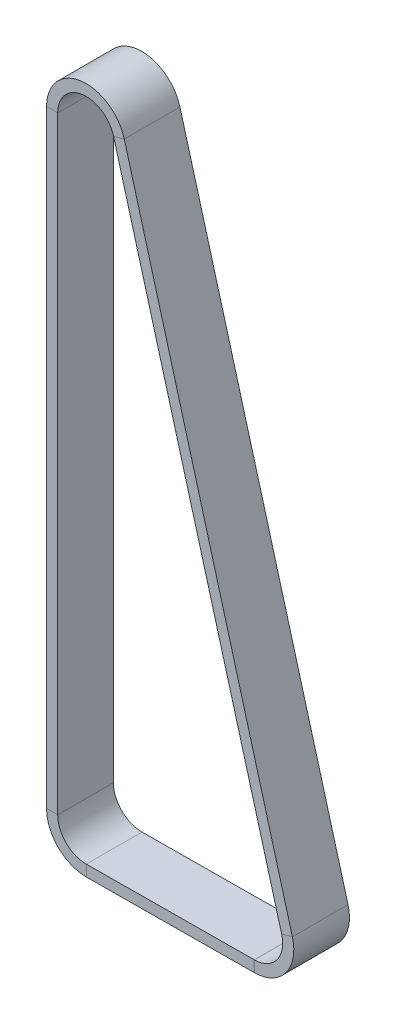
ISO-10303-21;
HEADER;
FILE_DESCRIPTION(('STEP AP214'),'2;1');
FILE_NAME('part.step','',(''),(''),'','','');
FILE_SCHEMA(('AUTOMOTIVE_DESIGN { 1 0 10303 214 1 1 1 1 }'));
ENDSEC;
DATA;
#1=APPLICATION_CONTEXT('core data for automotive mechanical design processes');
#2=APPLICATION_PROTOCOL_DEFINITION('international standard','automotive_design',2000,#1);
#3=PRODUCT_CONTEXT('',#1,'mechanical');
#4=PRODUCT('Part','Part','',(#3));
#5=PRODUCT_RELATED_PRODUCT_CATEGORY('part','',(#4));
#6=PRODUCT_DEFINITION_FORMATION('','',#4);
#7=PRODUCT_DEFINITION_CONTEXT('part definition',#1,'design');
#8=PRODUCT_DEFINITION('design','',#6,#7);
#9=PRODUCT_DEFINITION_SHAPE('','',#8);
#10=(LENGTH_UNIT() NAMED_UNIT(*) SI_UNIT(.MILLI.,.METRE.));
#11=(NAMED_UNIT(*) PLANE_ANGLE_UNIT() SI_UNIT($,.RADIAN.));
#12=(NAMED_UNIT(*) SI_UNIT($,.STERADIAN.) SOLID_ANGLE_UNIT());
#13=UNCERTAINTY_MEASURE_WITH_UNIT(LENGTH_MEASURE(1.E-05),#10,'distance_accuracy_value','');
#14=(GEOMETRIC_REPRESENTATION_CONTEXT(3) GLOBAL_UNCERTAINTY_ASSIGNED_CONTEXT((#13)) GLOBAL_UNIT_ASSIGNED_CONTEXT((#10,
#11,#12)) REPRESENTATION_CONTEXT('',''));
#15=CARTESIAN_POINT('',(0.,0.,0.));
#16=DIRECTION('',(0.,0.,1.));
#17=DIRECTION('',(1.,0.,0.));
#18=AXIS2_PLACEMENT_3D('',#15,#16,#17);
#19=CARTESIAN_POINT('',(0.,-7.1120626357686,5.));
#20=DIRECTION('',(0.,0.,-1.));
#21=DIRECTION('',(-1.,0.,0.));
#22=AXIS2_PLACEMENT_3D('',#19,#20,#21);
#23=PLANE('',#22);
#24=DIRECTION('',(0.,1.,0.));
#25=VECTOR('',#24,1.);
#26=CARTESIAN_POINT('',(0.,-7.1120626357686,5.));
#27=LINE('',#26,#25);
#28=CARTESIAN_POINT('',(0.,-7.1120626357686,5.));
#29=VERTEX_POINT('',#28);
#30=CARTESIAN_POINT('',(0.,-5.1120626357686,5.));
#31=VERTEX_POINT('',#30);
#32=EDGE_CURVE('E190',#29,#31,#27,.T.);
#33=ORIENTED_EDGE('',*,*,#32,.F.);
#34=DIRECTION('',(0.999977018890472,0.0067795052123793,0.));
#35=VECTOR('',#34,1.);
#36=CARTESIAN_POINT('',(0.,-7.1120626357686,5.));
#37=LINE('',#36,#35);
#38=CARTESIAN_POINT('',(0.0414377127931975,-7.1117817021227,5.));
#39=VERTEX_POINT('',#38);
#40=EDGE_CURVE('E189',#29,#39,#37,.T.);
#41=ORIENTED_EDGE('',*,*,#40,.T.);
#42=DIRECTION('',(-1.99979754977875E-11,1.,0.));
#43=VECTOR('',#42,1.);
#44=CARTESIAN_POINT('',(0.0414377127931975,-7.1117817021227,5.));
#45=LINE('',#44,#43);
#46=CARTESIAN_POINT('',(0.0414377127532015,-5.1117817021227,5.));
#47=VERTEX_POINT('',#46);
#48=EDGE_CURVE('E164',#39,#47,#45,.T.);
#49=ORIENTED_EDGE('',*,*,#48,.T.);
#50=DIRECTION('',(0.999977018890472,0.0067795052123793,0.));
#51=VECTOR('',#50,1.);
#52=CARTESIAN_POINT('',(0.,-5.1120626357686,5.));
#53=LINE('',#52,#51);
#54=EDGE_CURVE('E194',#31,#47,#53,.T.);
#55=ORIENTED_EDGE('',*,*,#54,.F.);
#56=EDGE_LOOP('',(#33,#41,#49,#55));
#57=FACE_BOUND('',#56,.T.);
#58=ADVANCED_FACE('F32',(#57),#23,.F.);
#59=CARTESIAN_POINT('',(0.0414377127931975,-7.1117817021227,5.));
#60=DIRECTION('',(0.,0.,-1.));
#61=DIRECTION('',(-1.,0.,0.));
#62=AXIS2_PLACEMENT_3D('',#59,#60,#61);
#63=PLANE('',#62);
#64=CARTESIAN_POINT('',(-1.31221856297659E-10,-9.04441452287408E-12,5.));
#65=DIRECTION('',(0.,0.,1.));
#66=DIRECTION('',(0.00810604870896083,-0.999967145447453,0.));
#67=AXIS2_PLACEMENT_3D('',#64,#65,#66);
#68=CIRCLE('',#67,5.11194965293215);
#69=CARTESIAN_POINT('',(4.92460125885224,1.37125187114068,5.));
#70=VERTEX_POINT('',#69);
#71=EDGE_CURVE('E170',#47,#70,#68,.T.);
#72=ORIENTED_EDGE('',*,*,#71,.F.);
#73=ORIENTED_EDGE('',*,*,#48,.F.);
#74=CARTESIAN_POINT('',(-1.31221856297659E-10,-9.04441452287408E-12,5.));
#75=DIRECTION('',(0.,0.,1.));
#76=DIRECTION('',(0.005826530014698,-0.999983025629929,0.));
#77=AXIS2_PLACEMENT_3D('',#74,#75,#76);
#78=CIRCLE('',#77,7.11190242217728);
#79=CARTESIAN_POINT('',(6.85558854665341,1.8921051080033,5.));
#80=VERTEX_POINT('',#79);
#81=EDGE_CURVE('E168',#39,#80,#78,.T.);
#82=ORIENTED_EDGE('',*,*,#81,.T.);
#83=DIRECTION('',(-0.965493643900586,-0.260426618431312,0.));
#84=VECTOR('',#83,1.);
#85=CARTESIAN_POINT('',(6.85558854665341,1.8921051080033,5.));
#86=LINE('',#85,#84);
#87=EDGE_CURVE('E186',#80,#70,#86,.T.);
#88=ORIENTED_EDGE('',*,*,#87,.T.);
#89=EDGE_LOOP('',(#72,#73,#82,#88));
#90=FACE_BOUND('',#89,.T.);
#91=ADVANCED_FACE('F166',(#90),#63,.F.);
#92=CARTESIAN_POINT('',(-1.31221856297659E-10,-9.04441452287408E-12,0.));
#93=DIRECTION('',(0.,0.,1.));
#94=DIRECTION('',(1.,0.,0.));
#95=AXIS2_PLACEMENT_3D('',#92,#93,#94);
#96=CYLINDRICAL_SURFACE('',#95,5.11194965293215);
#97=CARTESIAN_POINT('',(-1.31221856297659E-10,-9.04441452287408E-12,-5.));
#98=DIRECTION('',(0.,0.,1.));
#99=DIRECTION('',(0.00810604870896083,-0.999967145447453,0.));
#100=AXIS2_PLACEMENT_3D('',#97,#98,#99);
#101=CIRCLE('',#100,5.11194965293215);
#102=CARTESIAN_POINT('',(0.0414377127532015,-5.1117817021227,-5.));
#103=VERTEX_POINT('',#102);
#104=CARTESIAN_POINT('',(4.92460125885224,1.37125187114068,-5.));
#105=VERTEX_POINT('',#104);
#106=EDGE_CURVE('E241',#103,#105,#101,.T.);
#107=ORIENTED_EDGE('',*,*,#106,.F.);
#108=DIRECTION('',(0.,0.,-1.));
#109=VECTOR('',#108,1.);
#110=CARTESIAN_POINT('',(0.0414377127532015,-5.1117817021227,5.));
#111=LINE('',#110,#109);
#112=EDGE_CURVE('E175',#47,#103,#111,.T.);
#113=ORIENTED_EDGE('',*,*,#112,.F.);
#114=ORIENTED_EDGE('',*,*,#71,.T.);
#115=DIRECTION('',(0.,0.,-1.));
#116=VECTOR('',#115,1.);
#117=CARTESIAN_POINT('',(4.92460125885224,1.37125187114068,5.));
#118=LINE('',#117,#116);
#119=EDGE_CURVE('E286',#70,#105,#118,.T.);
#120=ORIENTED_EDGE('',*,*,#119,.T.);
#121=EDGE_LOOP('',(#107,#113,#114,#120));
#122=FACE_BOUND('',#121,.T.);
#123=ADVANCED_FACE('F354',(#122),#96,.F.);
#124=CARTESIAN_POINT('',(0.0414377127931975,-7.1117817021227,-5.));
#125=DIRECTION('',(0.,0.,1.));
#126=DIRECTION('',(1.,0.,0.));
#127=AXIS2_PLACEMENT_3D('',#124,#125,#126);
#128=PLANE('',#127);
#129=CARTESIAN_POINT('',(-1.31221856297659E-10,-9.04441452287408E-12,-5.));
#130=DIRECTION('',(0.,0.,1.));
#131=DIRECTION('',(0.005826530014698,-0.999983025629929,0.));
#132=AXIS2_PLACEMENT_3D('',#129,#130,#131);
#133=CIRCLE('',#132,7.11190242217728);
#134=CARTESIAN_POINT('',(0.0414377127931975,-7.1117817021227,-5.));
#135=VERTEX_POINT('',#134);
#136=CARTESIAN_POINT('',(6.85558854665341,1.8921051080033,-5.));
#137=VERTEX_POINT('',#136);
#138=EDGE_CURVE('E205',#135,#137,#133,.T.);
#139=ORIENTED_EDGE('',*,*,#138,.F.);
#140=DIRECTION('',(-1.99979754977875E-11,1.,0.));
#141=VECTOR('',#140,1.);
#142=CARTESIAN_POINT('',(0.0414377127931975,-7.1117817021227,-5.));
#143=LINE('',#142,#141);
#144=EDGE_CURVE('E197',#103,#135,#143,.F.);
#145=ORIENTED_EDGE('',*,*,#144,.F.);
#146=ORIENTED_EDGE('',*,*,#106,.T.);
#147=DIRECTION('',(-0.965493643900586,-0.260426618431312,0.));
#148=VECTOR('',#147,1.);
#149=CARTESIAN_POINT('',(6.85558854665341,1.8921051080033,-5.));
#150=LINE('',#149,#148);
#151=EDGE_CURVE('E244',#105,#137,#150,.F.);
#152=ORIENTED_EDGE('',*,*,#151,.T.);
#153=EDGE_LOOP('',(#139,#145,#146,#152));
#154=FACE_BOUND('',#153,.T.);
#155=ADVANCED_FACE('F239',(#154),#128,.F.);
#156=CARTESIAN_POINT('',(-1.31221856297659E-10,-9.04441452287408E-12,0.));
#157=DIRECTION('',(0.,0.,1.));
#158=DIRECTION('',(1.,0.,0.));
#159=AXIS2_PLACEMENT_3D('',#156,#157,#158);
#160=CYLINDRICAL_SURFACE('',#159,7.11190242217728);
#161=DIRECTION('',(0.,0.,-1.));
#162=VECTOR('',#161,1.);
#163=CARTESIAN_POINT('',(6.85558854665341,1.8921051080033,5.));
#164=LINE('',#163,#162);
#165=EDGE_CURVE('E184',#137,#80,#164,.F.);
#166=ORIENTED_EDGE('',*,*,#165,.T.);
#167=ORIENTED_EDGE('',*,*,#81,.F.);
#168=DIRECTION('',(0.,0.,-1.));
#169=VECTOR('',#168,1.);
#170=CARTESIAN_POINT('',(0.0414377127931975,-7.1117817021227,5.));
#171=LINE('',#170,#169);
#172=EDGE_CURVE('E182',#135,#39,#171,.F.);
#173=ORIENTED_EDGE('',*,*,#172,.F.);
#174=ORIENTED_EDGE('',*,*,#138,.T.);
#175=EDGE_LOOP('',(#166,#167,#173,#174));
#176=FACE_BOUND('',#175,.T.);
#177=ADVANCED_FACE('F180',(#176),#160,.T.);
#178=CARTESIAN_POINT('',(6.85558854665344,1.89210510800318,5.));
#179=DIRECTION('',(0.,0.,-1.));
#180=DIRECTION('',(-1.,0.,0.));
#181=AXIS2_PLACEMENT_3D('',#178,#179,#180);
#182=PLANE('',#181);
#183=DIRECTION('',(-0.266966202729876,0.963705892168348,0.));
#184=VECTOR('',#183,1.);
#185=CARTESIAN_POINT('',(4.9246012588522,1.37125187114083,5.));
#186=LINE('',#185,#184);
#187=CARTESIAN_POINT('',(-25.280176898024,110.405737823927,5.));
#188=VERTEX_POINT('',#187);
#189=EDGE_CURVE('E292',#70,#188,#186,.T.);
#190=ORIENTED_EDGE('',*,*,#189,.F.);
#191=ORIENTED_EDGE('',*,*,#87,.F.);
#192=DIRECTION('',(-0.266966202729876,0.963705892168348,0.));
#193=VECTOR('',#192,1.);
#194=CARTESIAN_POINT('',(6.85558854665344,1.89210510800318,5.));
#195=LINE('',#194,#193);
#196=CARTESIAN_POINT('',(-23.3491896102227,110.92659106079,5.));
#197=VERTEX_POINT('',#196);
#198=EDGE_CURVE('E204',#80,#197,#195,.T.);
#199=ORIENTED_EDGE('',*,*,#198,.T.);
#200=DIRECTION('',(-0.965493643900623,-0.260426618431174,0.));
#201=VECTOR('',#200,1.);
#202=CARTESIAN_POINT('',(-23.3491896102227,110.92659106079,5.));
#203=LINE('',#202,#201);
#204=EDGE_CURVE('E326',#197,#188,#203,.T.);
#205=ORIENTED_EDGE('',*,*,#204,.T.);
#206=EDGE_LOOP('',(#190,#191,#199,#205));
#207=FACE_BOUND('',#206,.T.);
#208=ADVANCED_FACE('F329',(#207),#182,.F.);
#209=CARTESIAN_POINT('',(4.9246012588522,1.37125187114083,5.));
#210=DIRECTION('',(0.963705892168348,0.266966202729876,0.));
#211=DIRECTION('',(-0.266966202729876,0.963705892168348,0.));
#212=AXIS2_PLACEMENT_3D('',#209,#210,#211);
#213=PLANE('',#212);
#214=DIRECTION('',(-0.266966202729876,0.963705892168348,0.));
#215=VECTOR('',#214,1.);
#216=CARTESIAN_POINT('',(4.9246012588522,1.37125187114083,-5.));
#217=LINE('',#216,#215);
#218=CARTESIAN_POINT('',(-25.280176898024,110.405737823927,-5.));
#219=VERTEX_POINT('',#218);
#220=EDGE_CURVE('E252',#105,#219,#217,.T.);
#221=ORIENTED_EDGE('',*,*,#220,.F.);
#222=ORIENTED_EDGE('',*,*,#119,.F.);
#223=ORIENTED_EDGE('',*,*,#189,.T.);
#224=DIRECTION('',(0.,0.,-1.));
#225=VECTOR('',#224,1.);
#226=CARTESIAN_POINT('',(-25.280176898024,110.405737823927,5.));
#227=LINE('',#226,#225);
#228=EDGE_CURVE('E289',#188,#219,#227,.T.);
#229=ORIENTED_EDGE('',*,*,#228,.T.);
#230=EDGE_LOOP('',(#221,#222,#223,#229));
#231=FACE_BOUND('',#230,.T.);
#232=ADVANCED_FACE('F322',(#231),#213,.F.);
#233=CARTESIAN_POINT('',(6.85558854665344,1.89210510800318,-5.));
#234=DIRECTION('',(0.,0.,1.));
#235=DIRECTION('',(1.,0.,0.));
#236=AXIS2_PLACEMENT_3D('',#233,#234,#235);
#237=PLANE('',#236);
#238=DIRECTION('',(-0.266966202729876,0.963705892168348,0.));
#239=VECTOR('',#238,1.);
#240=CARTESIAN_POINT('',(6.85558854665344,1.89210510800318,-5.));
#241=LINE('',#240,#239);
#242=CARTESIAN_POINT('',(-23.3491896102227,110.92659106079,-5.));
#243=VERTEX_POINT('',#242);
#244=EDGE_CURVE('E210',#137,#243,#241,.T.);
#245=ORIENTED_EDGE('',*,*,#244,.F.);
#246=ORIENTED_EDGE('',*,*,#151,.F.);
#247=ORIENTED_EDGE('',*,*,#220,.T.);
#248=DIRECTION('',(-0.965493643900623,-0.260426618431174,0.));
#249=VECTOR('',#248,1.);
#250=CARTESIAN_POINT('',(-23.3491896102227,110.92659106079,-5.));
#251=LINE('',#250,#249);
#252=EDGE_CURVE('E249',#219,#243,#251,.F.);
#253=ORIENTED_EDGE('',*,*,#252,.T.);
#254=EDGE_LOOP('',(#245,#246,#247,#253));
#255=FACE_BOUND('',#254,.T.);
#256=ADVANCED_FACE('F318',(#255),#237,.F.);
#257=CARTESIAN_POINT('',(6.85558854665344,1.89210510800318,5.));
#258=DIRECTION('',(-0.963705892168348,-0.266966202729876,0.));
#259=DIRECTION('',(0.266966202729876,-0.963705892168348,0.));
#260=AXIS2_PLACEMENT_3D('',#257,#258,#259);
#261=PLANE('',#260);
#262=DIRECTION('',(0.,0.,-1.));
#263=VECTOR('',#262,1.);
#264=CARTESIAN_POINT('',(-23.3491896102227,110.92659106079,5.));
#265=LINE('',#264,#263);
#266=EDGE_CURVE('E206',#243,#197,#265,.F.);
#267=ORIENTED_EDGE('',*,*,#266,.T.);
#268=ORIENTED_EDGE('',*,*,#198,.F.);
#269=ORIENTED_EDGE('',*,*,#165,.F.);
#270=ORIENTED_EDGE('',*,*,#244,.T.);
#271=EDGE_LOOP('',(#267,#268,#269,#270));
#272=FACE_BOUND('',#271,.T.);
#273=ADVANCED_FACE('F316',(#272),#261,.F.);
#274=CARTESIAN_POINT('',(-23.3491896102227,110.92659106079,5.));
#275=DIRECTION('',(0.,0.,-1.));
#276=DIRECTION('',(-1.,0.,0.));
#277=AXIS2_PLACEMENT_3D('',#274,#275,#276);
#278=PLANE('',#277);
#279=CARTESIAN_POINT('',(-30.2047781570076,109.034485952778,5.));
#280=DIRECTION('',(0.,0.,1.));
#281=DIRECTION('',(0.963350892190218,0.26824440071754,0.));
#282=AXIS2_PLACEMENT_3D('',#279,#280,#281);
#283=CIRCLE('',#282,5.11194965293214);
#284=CARTESIAN_POINT('',(-35.3167233118967,109.02770454298,5.));
#285=VERTEX_POINT('',#284);
#286=EDGE_CURVE('E296',#188,#285,#283,.T.);
#287=ORIENTED_EDGE('',*,*,#286,.F.);
#288=ORIENTED_EDGE('',*,*,#204,.F.);
#289=CARTESIAN_POINT('',(-30.2047781570076,109.034485952778,5.));
#290=DIRECTION('',(0.,0.,1.));
#291=DIRECTION('',(0.963959871750616,0.266047675529285,0.));
#292=AXIS2_PLACEMENT_3D('',#289,#290,#291);
#293=CIRCLE('',#292,7.11190242217727);
#294=CARTESIAN_POINT('',(-37.3166773496776,109.041263553407,5.));
#295=VERTEX_POINT('',#294);
#296=EDGE_CURVE('E209',#197,#295,#293,.T.);
#297=ORIENTED_EDGE('',*,*,#296,.T.);
#298=DIRECTION('',(0.999977018890464,-0.00677950521350091,0.));
#299=VECTOR('',#298,1.);
#300=CARTESIAN_POINT('',(-37.3166773496777,109.041263553407,5.));
#301=LINE('',#300,#299);
#302=EDGE_CURVE('E334',#295,#285,#301,.T.);
#303=ORIENTED_EDGE('',*,*,#302,.T.);
#304=EDGE_LOOP('',(#287,#288,#297,#303));
#305=FACE_BOUND('',#304,.T.);
#306=ADVANCED_FACE('F332',(#305),#278,.F.);
#307=CARTESIAN_POINT('',(-30.2047781570076,109.034485952778,0.));
#308=DIRECTION('',(0.,0.,1.));
#309=DIRECTION('',(1.,0.,0.));
#310=AXIS2_PLACEMENT_3D('',#307,#308,#309);
#311=CYLINDRICAL_SURFACE('',#310,5.11194965293214);
#312=CARTESIAN_POINT('',(-30.2047781570076,109.034485952778,-5.));
#313=DIRECTION('',(0.,0.,1.));
#314=DIRECTION('',(0.963350892190218,0.26824440071754,0.));
#315=AXIS2_PLACEMENT_3D('',#312,#313,#314);
#316=CIRCLE('',#315,5.11194965293214);
#317=CARTESIAN_POINT('',(-35.3167233118967,109.02770454298,-5.));
#318=VERTEX_POINT('',#317);
#319=EDGE_CURVE('E257',#219,#318,#316,.T.);
#320=ORIENTED_EDGE('',*,*,#319,.F.);
#321=ORIENTED_EDGE('',*,*,#228,.F.);
#322=ORIENTED_EDGE('',*,*,#286,.T.);
#323=DIRECTION('',(0.,0.,-1.));
#324=VECTOR('',#323,1.);
#325=CARTESIAN_POINT('',(-35.3167233118967,109.02770454298,5.));
#326=LINE('',#325,#324);
#327=EDGE_CURVE('E294',#285,#318,#326,.T.);
#328=ORIENTED_EDGE('',*,*,#327,.T.);
#329=EDGE_LOOP('',(#320,#321,#322,#328));
#330=FACE_BOUND('',#329,.T.);
#331=ADVANCED_FACE('F304',(#330),#311,.F.);
#332=CARTESIAN_POINT('',(-23.3491896102227,110.92659106079,-5.));
#333=DIRECTION('',(0.,0.,1.));
#334=DIRECTION('',(1.,0.,0.));
#335=AXIS2_PLACEMENT_3D('',#332,#333,#334);
#336=PLANE('',#335);
#337=CARTESIAN_POINT('',(-30.2047781570076,109.034485952778,-5.));
#338=DIRECTION('',(0.,0.,1.));
#339=DIRECTION('',(0.963959871750616,0.266047675529285,0.));
#340=AXIS2_PLACEMENT_3D('',#337,#338,#339);
#341=CIRCLE('',#340,7.11190242217727);
#342=CARTESIAN_POINT('',(-37.3166773496776,109.041263553407,-5.));
#343=VERTEX_POINT('',#342);
#344=EDGE_CURVE('E215',#243,#343,#341,.T.);
#345=ORIENTED_EDGE('',*,*,#344,.F.);
#346=ORIENTED_EDGE('',*,*,#252,.F.);
#347=ORIENTED_EDGE('',*,*,#319,.T.);
#348=DIRECTION('',(0.999977018890464,-0.00677950521350091,0.));
#349=VECTOR('',#348,1.);
#350=CARTESIAN_POINT('',(-37.3166773496777,109.041263553407,-5.));
#351=LINE('',#350,#349);
#352=EDGE_CURVE('E254',#318,#343,#351,.F.);
#353=ORIENTED_EDGE('',*,*,#352,.T.);
#354=EDGE_LOOP('',(#345,#346,#347,#353));
#355=FACE_BOUND('',#354,.T.);
#356=ADVANCED_FACE('F301',(#355),#336,.F.);
#357=CARTESIAN_POINT('',(-30.2047781570076,109.034485952778,0.));
#358=DIRECTION('',(0.,0.,1.));
#359=DIRECTION('',(1.,0.,0.));
#360=AXIS2_PLACEMENT_3D('',#357,#358,#359);
#361=CYLINDRICAL_SURFACE('',#360,7.11190242217727);
#362=DIRECTION('',(0.,0.,-1.));
#363=VECTOR('',#362,1.);
#364=CARTESIAN_POINT('',(-37.3166773496777,109.041263553407,5.));
#365=LINE('',#364,#363);
#366=EDGE_CURVE('E211',#343,#295,#365,.F.);
#367=ORIENTED_EDGE('',*,*,#366,.T.);
#368=ORIENTED_EDGE('',*,*,#296,.F.);
#369=ORIENTED_EDGE('',*,*,#266,.F.);
#370=ORIENTED_EDGE('',*,*,#344,.T.);
#371=EDGE_LOOP('',(#367,#368,#369,#370));
#372=FACE_BOUND('',#371,.T.);
#373=ADVANCED_FACE('F313',(#372),#361,.T.);
#374=CARTESIAN_POINT('',(-37.3166773496777,109.041263553406,5.));
#375=DIRECTION('',(0.,0.,-1.));
#376=DIRECTION('',(-1.,0.,0.));
#377=AXIS2_PLACEMENT_3D('',#374,#375,#376);
#378=PLANE('',#377);
#379=DIRECTION('',(0.,-1.,0.));
#380=VECTOR('',#379,1.);
#381=CARTESIAN_POINT('',(-35.3167233118967,109.027704542982,5.));
#382=LINE('',#381,#380);
#383=CARTESIAN_POINT('',(-35.3167233118967,-0.211559566788297,5.));
#384=VERTEX_POINT('',#383);
#385=EDGE_CURVE('E141',#285,#384,#382,.T.);
#386=ORIENTED_EDGE('',*,*,#385,.F.);
#387=ORIENTED_EDGE('',*,*,#302,.F.);
#388=DIRECTION('',(0.,-1.,0.));
#389=VECTOR('',#388,1.);
#390=CARTESIAN_POINT('',(-37.3166773496777,109.041263553406,5.));
#391=LINE('',#390,#389);
#392=CARTESIAN_POINT('',(-37.3166773496777,-0.198000556363542,5.));
#393=VERTEX_POINT('',#392);
#394=EDGE_CURVE('E214',#295,#393,#391,.T.);
#395=ORIENTED_EDGE('',*,*,#394,.T.);
#396=DIRECTION('',(0.999977018890472,-0.00677950521237931,0.));
#397=VECTOR('',#396,1.);
#398=CARTESIAN_POINT('',(-37.3166773496777,-0.198000556363544,5.));
#399=LINE('',#398,#397);
#400=EDGE_CURVE('E261',#393,#384,#399,.T.);
#401=ORIENTED_EDGE('',*,*,#400,.T.);
#402=EDGE_LOOP('',(#386,#387,#395,#401));
#403=FACE_BOUND('',#402,.T.);
#404=ADVANCED_FACE('F380',(#403),#378,.F.);
#405=CARTESIAN_POINT('',(-35.3167233118967,109.027704542982,5.));
#406=DIRECTION('',(-1.,0.,0.));
#407=DIRECTION('',(0.,0.,1.));
#408=AXIS2_PLACEMENT_3D('',#405,#406,#407);
#409=PLANE('',#408);
#410=DIRECTION('',(0.,-1.,0.));
#411=VECTOR('',#410,1.);
#412=CARTESIAN_POINT('',(-35.3167233118967,109.027704542982,-5.));
#413=LINE('',#412,#411);
#414=CARTESIAN_POINT('',(-35.3167233118967,-0.211559566788297,-5.));
#415=VERTEX_POINT('',#414);
#416=EDGE_CURVE('E135',#318,#415,#413,.T.);
#417=ORIENTED_EDGE('',*,*,#416,.F.);
#418=ORIENTED_EDGE('',*,*,#327,.F.);
#419=ORIENTED_EDGE('',*,*,#385,.T.);
#420=DIRECTION('',(0.,0.,-1.));
#421=VECTOR('',#420,1.);
#422=CARTESIAN_POINT('',(-35.3167233118967,-0.211559566788303,5.));
#423=LINE('',#422,#421);
#424=EDGE_CURVE('E259',#384,#415,#423,.T.);
#425=ORIENTED_EDGE('',*,*,#424,.T.);
#426=EDGE_LOOP('',(#417,#418,#419,#425));
#427=FACE_BOUND('',#426,.T.);
#428=ADVANCED_FACE('F307',(#427),#409,.F.);
#429=CARTESIAN_POINT('',(-37.3166773496777,109.041263553406,-5.));
#430=DIRECTION('',(0.,0.,1.));
#431=DIRECTION('',(1.,0.,0.));
#432=AXIS2_PLACEMENT_3D('',#429,#430,#431);
#433=PLANE('',#432);
#434=DIRECTION('',(0.,-1.,0.));
#435=VECTOR('',#434,1.);
#436=CARTESIAN_POINT('',(-37.3166773496777,109.041263553406,-5.));
#437=LINE('',#436,#435);
#438=CARTESIAN_POINT('',(-37.3166773496777,-0.198000556363542,-5.));
#439=VERTEX_POINT('',#438);
#440=EDGE_CURVE('E260',#343,#439,#437,.T.);
#441=ORIENTED_EDGE('',*,*,#440,.F.);
#442=ORIENTED_EDGE('',*,*,#352,.F.);
#443=ORIENTED_EDGE('',*,*,#416,.T.);
#444=DIRECTION('',(0.999977018890472,-0.00677950521237931,0.));
#445=VECTOR('',#444,1.);
#446=CARTESIAN_POINT('',(-37.3166773496777,-0.198000556363544,-5.));
#447=LINE('',#446,#445);
#448=EDGE_CURVE('E219',#415,#439,#447,.F.);
#449=ORIENTED_EDGE('',*,*,#448,.T.);
#450=EDGE_LOOP('',(#441,#442,#443,#449));
#451=FACE_BOUND('',#450,.T.);
#452=ADVANCED_FACE('F308',(#451),#433,.F.);
#453=CARTESIAN_POINT('',(-37.3166773496777,109.041263553406,5.));
#454=DIRECTION('',(1.,0.,0.));
#455=DIRECTION('',(0.,0.,-1.));
#456=AXIS2_PLACEMENT_3D('',#453,#454,#455);
#457=PLANE('',#456);
#458=DIRECTION('',(0.,0.,-1.));
#459=VECTOR('',#458,1.);
#460=CARTESIAN_POINT('',(-37.3166773496777,-0.198000556363544,5.));
#461=LINE('',#460,#459);
#462=EDGE_CURVE('E216',#439,#393,#461,.F.);
#463=ORIENTED_EDGE('',*,*,#462,.T.);
#464=ORIENTED_EDGE('',*,*,#394,.F.);
#465=ORIENTED_EDGE('',*,*,#366,.F.);
#466=ORIENTED_EDGE('',*,*,#440,.T.);
#467=EDGE_LOOP('',(#463,#464,#465,#466));
#468=FACE_BOUND('',#467,.T.);
#469=ADVANCED_FACE('F310',(#468),#457,.F.);
#470=CARTESIAN_POINT('',(-37.3166773496777,-0.198000556362425,5.));
#471=DIRECTION('',(0.,0.,-1.));
#472=DIRECTION('',(-1.,0.,0.));
#473=AXIS2_PLACEMENT_3D('',#470,#471,#472);
#474=PLANE('',#473);
#475=CARTESIAN_POINT('',(-30.2047781570076,-0.204778156991603,5.));
#476=DIRECTION('',(0.,0.,1.));
#477=DIRECTION('',(-0.999999120092461,-0.00132657992707971,0.));
#478=AXIS2_PLACEMENT_3D('',#475,#476,#477);
#479=CIRCLE('',#478,5.11194965293214);
#480=CARTESIAN_POINT('',(-30.1633404442254,-5.31655985910609,5.));
#481=VERTEX_POINT('',#480);
#482=EDGE_CURVE('E112',#384,#481,#479,.T.);
#483=ORIENTED_EDGE('',*,*,#482,.F.);
#484=ORIENTED_EDGE('',*,*,#400,.F.);
#485=CARTESIAN_POINT('',(-30.2047781570076,-0.204778156991603,5.));
#486=DIRECTION('',(0.,0.,1.));
#487=DIRECTION('',(-0.999999545901076,0.000952994041094208,0.));
#488=AXIS2_PLACEMENT_3D('',#485,#486,#487);
#489=CIRCLE('',#488,7.11190242217728);
#490=CARTESIAN_POINT('',(-30.1633404442254,-7.31655985910609,5.));
#491=VERTEX_POINT('',#490);
#492=EDGE_CURVE('E218',#393,#491,#489,.T.);
#493=ORIENTED_EDGE('',*,*,#492,.T.);
#494=DIRECTION('',(0.,1.,0.));
#495=VECTOR('',#494,1.);
#496=CARTESIAN_POINT('',(-30.1633404442254,-7.31655985910609,5.));
#497=LINE('',#496,#495);
#498=EDGE_CURVE('E341',#491,#481,#497,.T.);
#499=ORIENTED_EDGE('',*,*,#498,.T.);
#500=EDGE_LOOP('',(#483,#484,#493,#499));
#501=FACE_BOUND('',#500,.T.);
#502=ADVANCED_FACE('F375',(#501),#474,.F.);
#503=CARTESIAN_POINT('',(-30.2047781570076,-0.204778156991603,0.));
#504=DIRECTION('',(0.,0.,1.));
#505=DIRECTION('',(1.,0.,0.));
#506=AXIS2_PLACEMENT_3D('',#503,#504,#505);
#507=CYLINDRICAL_SURFACE('',#506,5.11194965293214);
#508=CARTESIAN_POINT('',(-30.2047781570076,-0.204778156991603,-5.));
#509=DIRECTION('',(0.,0.,1.));
#510=DIRECTION('',(-0.999999120092461,-0.00132657992707971,0.));
#511=AXIS2_PLACEMENT_3D('',#508,#509,#510);
#512=CIRCLE('',#511,5.11194965293214);
#513=CARTESIAN_POINT('',(-30.1633404442254,-5.31655985910609,-5.));
#514=VERTEX_POINT('',#513);
#515=EDGE_CURVE('E105',#415,#514,#512,.T.);
#516=ORIENTED_EDGE('',*,*,#515,.F.);
#517=ORIENTED_EDGE('',*,*,#424,.F.);
#518=ORIENTED_EDGE('',*,*,#482,.T.);
#519=DIRECTION('',(0.,0.,-1.));
#520=VECTOR('',#519,1.);
#521=CARTESIAN_POINT('',(-30.1633404442254,-5.31655985910609,5.));
#522=LINE('',#521,#520);
#523=EDGE_CURVE('E271',#481,#514,#522,.T.);
#524=ORIENTED_EDGE('',*,*,#523,.T.);
#525=EDGE_LOOP('',(#516,#517,#518,#524));
#526=FACE_BOUND('',#525,.T.);
#527=ADVANCED_FACE('F378',(#526),#507,.F.);
#528=CARTESIAN_POINT('',(-37.3166773496777,-0.198000556362425,-5.));
#529=DIRECTION('',(0.,0.,1.));
#530=DIRECTION('',(1.,0.,0.));
#531=AXIS2_PLACEMENT_3D('',#528,#529,#530);
#532=PLANE('',#531);
#533=CARTESIAN_POINT('',(-30.2047781570076,-0.204778156991603,-5.));
#534=DIRECTION('',(0.,0.,1.));
#535=DIRECTION('',(-0.999999545901076,0.000952994041094208,0.));
#536=AXIS2_PLACEMENT_3D('',#533,#534,#535);
#537=CIRCLE('',#536,7.11190242217728);
#538=CARTESIAN_POINT('',(-30.1633404442254,-7.31655985910609,-5.));
#539=VERTEX_POINT('',#538);
#540=EDGE_CURVE('E96',#439,#539,#537,.T.);
#541=ORIENTED_EDGE('',*,*,#540,.F.);
#542=ORIENTED_EDGE('',*,*,#448,.F.);
#543=ORIENTED_EDGE('',*,*,#515,.T.);
#544=DIRECTION('',(0.,1.,0.));
#545=VECTOR('',#544,1.);
#546=CARTESIAN_POINT('',(-30.1633404442254,-7.31655985910609,-5.));
#547=LINE('',#546,#545);
#548=EDGE_CURVE('E225',#514,#539,#547,.F.);
#549=ORIENTED_EDGE('',*,*,#548,.T.);
#550=EDGE_LOOP('',(#541,#542,#543,#549));
#551=FACE_BOUND('',#550,.T.);
#552=ADVANCED_FACE('F404',(#551),#532,.F.);
#553=CARTESIAN_POINT('',(-30.2047781570076,-0.204778156991603,0.));
#554=DIRECTION('',(0.,0.,1.));
#555=DIRECTION('',(1.,0.,0.));
#556=AXIS2_PLACEMENT_3D('',#553,#554,#555);
#557=CYLINDRICAL_SURFACE('',#556,7.11190242217728);
#558=DIRECTION('',(0.,0.,-1.));
#559=VECTOR('',#558,1.);
#560=CARTESIAN_POINT('',(-30.1633404442254,-7.31655985910609,5.));
#561=LINE('',#560,#559);
#562=EDGE_CURVE('E220',#539,#491,#561,.F.);
#563=ORIENTED_EDGE('',*,*,#562,.T.);
#564=ORIENTED_EDGE('',*,*,#492,.F.);
#565=ORIENTED_EDGE('',*,*,#462,.F.);
#566=ORIENTED_EDGE('',*,*,#540,.T.);
#567=EDGE_LOOP('',(#563,#564,#565,#566));
#568=FACE_BOUND('',#567,.T.);
#569=ADVANCED_FACE('F374',(#568),#557,.T.);
#570=CARTESIAN_POINT('',(-30.1633404442254,-7.31655985910609,5.));
#571=DIRECTION('',(0.,0.,-1.));
#572=DIRECTION('',(-1.,0.,0.));
#573=AXIS2_PLACEMENT_3D('',#570,#571,#572);
#574=PLANE('',#573);
#575=DIRECTION('',(0.999977018890472,0.0067795052123793,0.));
#576=VECTOR('',#575,1.);
#577=CARTESIAN_POINT('',(-30.1633404442254,-5.31655985910609,5.));
#578=LINE('',#577,#576);
#579=EDGE_CURVE('E276',#481,#31,#578,.T.);
#580=ORIENTED_EDGE('',*,*,#579,.F.);
#581=ORIENTED_EDGE('',*,*,#498,.F.);
#582=DIRECTION('',(0.999977018890472,0.0067795052123793,0.));
#583=VECTOR('',#582,1.);
#584=CARTESIAN_POINT('',(-30.1633404442254,-7.31655985910609,5.));
#585=LINE('',#584,#583);
#586=EDGE_CURVE('E221',#491,#29,#585,.T.);
#587=ORIENTED_EDGE('',*,*,#586,.T.);
#588=ORIENTED_EDGE('',*,*,#32,.T.);
#589=EDGE_LOOP('',(#580,#581,#587,#588));
#590=FACE_BOUND('',#589,.T.);
#591=ADVANCED_FACE('F371',(#590),#574,.F.);
#592=CARTESIAN_POINT('',(-30.1633404442254,-5.31655985910609,5.));
#593=DIRECTION('',(0.00677950521237931,-0.999977018890472,0.));
#594=DIRECTION('',(0.999977018890472,0.00677950521237931,0.));
#595=AXIS2_PLACEMENT_3D('',#592,#593,#594);
#596=PLANE('',#595);
#597=DIRECTION('',(0.999977018890472,0.0067795052123793,0.));
#598=VECTOR('',#597,1.);
#599=CARTESIAN_POINT('',(-30.1633404442254,-5.31655985910609,-5.));
#600=LINE('',#599,#598);
#601=CARTESIAN_POINT('',(0.,-5.1120626357686,-5.));
#602=VERTEX_POINT('',#601);
#603=EDGE_CURVE('E57',#514,#602,#600,.T.);
#604=ORIENTED_EDGE('',*,*,#603,.F.);
#605=ORIENTED_EDGE('',*,*,#523,.F.);
#606=ORIENTED_EDGE('',*,*,#579,.T.);
#607=DIRECTION('',(0.,0.,-1.));
#608=VECTOR('',#607,1.);
#609=CARTESIAN_POINT('',(0.,-5.1120626357686,5.));
#610=LINE('',#609,#608);
#611=EDGE_CURVE('E274',#31,#602,#610,.T.);
#612=ORIENTED_EDGE('',*,*,#611,.T.);
#613=EDGE_LOOP('',(#604,#605,#606,#612));
#614=FACE_BOUND('',#613,.T.);
#615=ADVANCED_FACE('F349',(#614),#596,.F.);
#616=CARTESIAN_POINT('',(-30.1633404442254,-7.31655985910609,-5.));
#617=DIRECTION('',(0.,0.,1.));
#618=DIRECTION('',(1.,0.,0.));
#619=AXIS2_PLACEMENT_3D('',#616,#617,#618);
#620=PLANE('',#619);
#621=DIRECTION('',(0.999977018890472,0.0067795052123793,0.));
#622=VECTOR('',#621,1.);
#623=CARTESIAN_POINT('',(-30.1633404442254,-7.31655985910609,-5.));
#624=LINE('',#623,#622);
#625=CARTESIAN_POINT('',(0.,-7.1120626357686,-5.));
#626=VERTEX_POINT('',#625);
#627=EDGE_CURVE('E49',#539,#626,#624,.T.);
#628=ORIENTED_EDGE('',*,*,#627,.F.);
#629=ORIENTED_EDGE('',*,*,#548,.F.);
#630=ORIENTED_EDGE('',*,*,#603,.T.);
#631=DIRECTION('',(0.,1.,0.));
#632=VECTOR('',#631,1.);
#633=CARTESIAN_POINT('',(0.,-7.1120626357686,-5.));
#634=LINE('',#633,#632);
#635=EDGE_CURVE('E230',#602,#626,#634,.F.);
#636=ORIENTED_EDGE('',*,*,#635,.T.);
#637=EDGE_LOOP('',(#628,#629,#630,#636));
#638=FACE_BOUND('',#637,.T.);
#639=ADVANCED_FACE('F406',(#638),#620,.F.);
#640=CARTESIAN_POINT('',(-30.1633404442254,-7.31655985910609,5.));
#641=DIRECTION('',(-0.00677950521237931,0.999977018890472,0.));
#642=DIRECTION('',(-0.999977018890472,-0.00677950521237931,0.));
#643=AXIS2_PLACEMENT_3D('',#640,#641,#642);
#644=PLANE('',#643);
#645=DIRECTION('',(0.,0.,-1.));
#646=VECTOR('',#645,1.);
#647=CARTESIAN_POINT('',(0.,-7.1120626357686,5.));
#648=LINE('',#647,#646);
#649=EDGE_CURVE('E36',#626,#29,#648,.F.);
#650=ORIENTED_EDGE('',*,*,#649,.T.);
#651=ORIENTED_EDGE('',*,*,#586,.F.);
#652=ORIENTED_EDGE('',*,*,#562,.F.);
#653=ORIENTED_EDGE('',*,*,#627,.T.);
#654=EDGE_LOOP('',(#650,#651,#652,#653));
#655=FACE_BOUND('',#654,.T.);
#656=ADVANCED_FACE('F231',(#655),#644,.F.);
#657=CARTESIAN_POINT('',(0.,-5.1120626357686,5.));
#658=DIRECTION('',(0.0067795052123793,-0.999977018890472,0.));
#659=DIRECTION('',(0.999977018890472,0.0067795052123793,0.));
#660=AXIS2_PLACEMENT_3D('',#657,#658,#659);
#661=PLANE('',#660);
#662=ORIENTED_EDGE('',*,*,#54,.T.);
#663=ORIENTED_EDGE('',*,*,#112,.T.);
#664=DIRECTION('',(0.999977018890472,0.0067795052123793,0.));
#665=VECTOR('',#664,1.);
#666=CARTESIAN_POINT('',(0.,-5.1120626357686,-5.));
#667=LINE('',#666,#665);
#668=EDGE_CURVE('E41',#602,#103,#667,.T.);
#669=ORIENTED_EDGE('',*,*,#668,.F.);
#670=ORIENTED_EDGE('',*,*,#611,.F.);
#671=EDGE_LOOP('',(#662,#663,#669,#670));
#672=FACE_BOUND('',#671,.T.);
#673=ADVANCED_FACE('F352',(#672),#661,.F.);
#674=CARTESIAN_POINT('',(0.,-7.1120626357686,-5.));
#675=DIRECTION('',(0.,0.,1.));
#676=DIRECTION('',(1.,0.,0.));
#677=AXIS2_PLACEMENT_3D('',#674,#675,#676);
#678=PLANE('',#677);
#679=ORIENTED_EDGE('',*,*,#668,.T.);
#680=ORIENTED_EDGE('',*,*,#144,.T.);
#681=DIRECTION('',(0.999977018890472,0.0067795052123793,0.));
#682=VECTOR('',#681,1.);
#683=CARTESIAN_POINT('',(0.,-7.1120626357686,-5.));
#684=LINE('',#683,#682);
#685=EDGE_CURVE('E11',#626,#135,#684,.T.);
#686=ORIENTED_EDGE('',*,*,#685,.F.);
#687=ORIENTED_EDGE('',*,*,#635,.F.);
#688=EDGE_LOOP('',(#679,#680,#686,#687));
#689=FACE_BOUND('',#688,.T.);
#690=ADVANCED_FACE('F235',(#689),#678,.F.);
#691=CARTESIAN_POINT('',(0.,-7.1120626357686,5.));
#692=DIRECTION('',(-0.0067795052123793,0.999977018890472,0.));
#693=DIRECTION('',(-0.999977018890472,-0.0067795052123793,0.));
#694=AXIS2_PLACEMENT_3D('',#691,#692,#693);
#695=PLANE('',#694);
#696=ORIENTED_EDGE('',*,*,#685,.T.);
#697=ORIENTED_EDGE('',*,*,#172,.T.);
#698=ORIENTED_EDGE('',*,*,#40,.F.);
#699=ORIENTED_EDGE('',*,*,#649,.F.);
#700=EDGE_LOOP('',(#696,#697,#698,#699));
#701=FACE_BOUND('',#700,.T.);
#702=ADVANCED_FACE('F34',(#701),#695,.F.);
#703=CLOSED_SHELL('',(#58,#91,#123,#155,#177,#208,#232,#256,#273,#306,#331,#356,#373,#404,#428,
#452,#469,#502,#527,#552,#569,#591,#615,#639,#656,#673,#690,#702));
#704=MANIFOLD_SOLID_BREP('B2',#703);
#705=ADVANCED_BREP_SHAPE_REPRESENTATION('',(#18,#704),#14);
#706=SHAPE_DEFINITION_REPRESENTATION(#9,#705);
ENDSEC;
END-ISO-10303-21;
